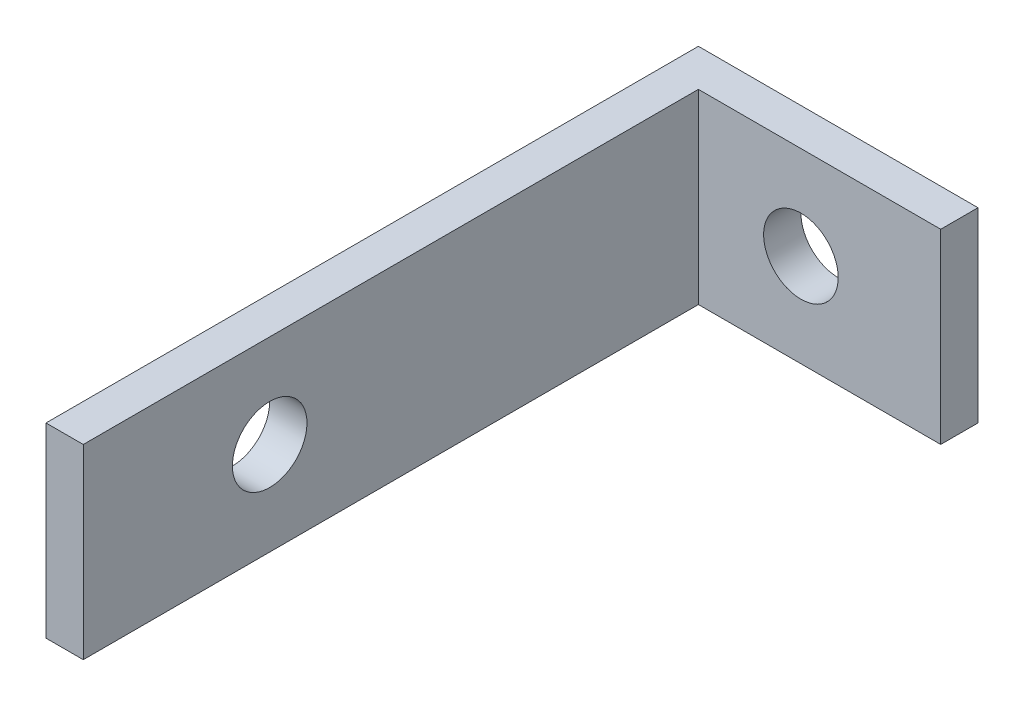
ISO-10303-21;
HEADER;
FILE_DESCRIPTION(('STEP AP214'),'2;1');
FILE_NAME('part.step','',(''),(''),'','','');
FILE_SCHEMA(('AUTOMOTIVE_DESIGN { 1 0 10303 214 1 1 1 1 }'));
ENDSEC;
DATA;
#1=APPLICATION_CONTEXT('core data for automotive mechanical design processes');
#2=APPLICATION_PROTOCOL_DEFINITION('international standard','automotive_design',2000,#1);
#3=PRODUCT_CONTEXT('',#1,'mechanical');
#4=PRODUCT('Part','Part','',(#3));
#5=PRODUCT_RELATED_PRODUCT_CATEGORY('part','',(#4));
#6=PRODUCT_DEFINITION_FORMATION('','',#4);
#7=PRODUCT_DEFINITION_CONTEXT('part definition',#1,'design');
#8=PRODUCT_DEFINITION('design','',#6,#7);
#9=PRODUCT_DEFINITION_SHAPE('','',#8);
#10=(LENGTH_UNIT() NAMED_UNIT(*) SI_UNIT(.MILLI.,.METRE.));
#11=(NAMED_UNIT(*) PLANE_ANGLE_UNIT() SI_UNIT($,.RADIAN.));
#12=(NAMED_UNIT(*) SI_UNIT($,.STERADIAN.) SOLID_ANGLE_UNIT());
#13=UNCERTAINTY_MEASURE_WITH_UNIT(LENGTH_MEASURE(1.E-05),#10,'distance_accuracy_value','');
#14=(GEOMETRIC_REPRESENTATION_CONTEXT(3) GLOBAL_UNCERTAINTY_ASSIGNED_CONTEXT((#13)) GLOBAL_UNIT_ASSIGNED_CONTEXT((#10,
#11,#12)) REPRESENTATION_CONTEXT('',''));
#15=CARTESIAN_POINT('',(0.,0.,0.));
#16=DIRECTION('',(0.,0.,1.));
#17=DIRECTION('',(1.,0.,0.));
#18=AXIS2_PLACEMENT_3D('',#15,#16,#17);
#19=CARTESIAN_POINT('',(7.5,5.,2.));
#20=DIRECTION('',(-1.,0.,0.));
#21=DIRECTION('',(0.,-1.,0.));
#22=AXIS2_PLACEMENT_3D('',#19,#20,#21);
#23=PLANE('',#22);
#24=DIRECTION('',(0.,1.,0.));
#25=VECTOR('',#24,1.);
#26=CARTESIAN_POINT('',(7.5,5.,0.));
#27=LINE('',#26,#25);
#28=CARTESIAN_POINT('',(7.5,-5.,0.));
#29=VERTEX_POINT('',#28);
#30=CARTESIAN_POINT('',(7.5,5.,0.));
#31=VERTEX_POINT('',#30);
#32=EDGE_CURVE('E90',#29,#31,#27,.T.);
#33=ORIENTED_EDGE('',*,*,#32,.T.);
#34=DIRECTION('',(0.,0.,-1.));
#35=VECTOR('',#34,1.);
#36=CARTESIAN_POINT('',(7.5,5.,2.));
#37=LINE('',#36,#35);
#38=CARTESIAN_POINT('',(7.5,5.,2.));
#39=VERTEX_POINT('',#38);
#40=EDGE_CURVE('E11',#39,#31,#37,.T.);
#41=ORIENTED_EDGE('',*,*,#40,.F.);
#42=DIRECTION('',(0.,1.,0.));
#43=VECTOR('',#42,1.);
#44=CARTESIAN_POINT('',(7.5,5.,2.));
#45=LINE('',#44,#43);
#46=CARTESIAN_POINT('',(7.5,-5.,2.));
#47=VERTEX_POINT('',#46);
#48=EDGE_CURVE('E84',#47,#39,#45,.T.);
#49=ORIENTED_EDGE('',*,*,#48,.F.);
#50=DIRECTION('',(0.,0.,-1.));
#51=VECTOR('',#50,1.);
#52=CARTESIAN_POINT('',(7.5,-5.,2.));
#53=LINE('',#52,#51);
#54=EDGE_CURVE('E76',#47,#29,#53,.T.);
#55=ORIENTED_EDGE('',*,*,#54,.T.);
#56=EDGE_LOOP('',(#33,#41,#49,#55));
#57=FACE_BOUND('',#56,.T.);
#58=ADVANCED_FACE('F34',(#57),#23,.F.);
#59=CARTESIAN_POINT('',(-7.5,5.,2.));
#60=DIRECTION('',(0.,-1.,0.));
#61=DIRECTION('',(0.,0.,-1.));
#62=AXIS2_PLACEMENT_3D('',#59,#60,#61);
#63=PLANE('',#62);
#64=DIRECTION('',(-1.,0.,0.));
#65=VECTOR('',#64,1.);
#66=CARTESIAN_POINT('',(-7.5,5.,0.));
#67=LINE('',#66,#65);
#68=CARTESIAN_POINT('',(-7.5,5.,0.));
#69=VERTEX_POINT('',#68);
#70=EDGE_CURVE('E93',#31,#69,#67,.T.);
#71=ORIENTED_EDGE('',*,*,#70,.T.);
#72=DIRECTION('',(0.,0.,-1.));
#73=VECTOR('',#72,1.);
#74=CARTESIAN_POINT('',(-7.5,5.,2.));
#75=LINE('',#74,#73);
#76=CARTESIAN_POINT('',(-7.5,5.,35.));
#77=VERTEX_POINT('',#76);
#78=EDGE_CURVE('E41',#77,#69,#75,.T.);
#79=ORIENTED_EDGE('',*,*,#78,.F.);
#80=DIRECTION('',(-1.,0.,0.));
#81=VECTOR('',#80,1.);
#82=CARTESIAN_POINT('',(-7.5,5.,35.));
#83=LINE('',#82,#81);
#84=CARTESIAN_POINT('',(-5.5,5.,35.));
#85=VERTEX_POINT('',#84);
#86=EDGE_CURVE('E117',#85,#77,#83,.T.);
#87=ORIENTED_EDGE('',*,*,#86,.F.);
#88=DIRECTION('',(0.,0.,-1.));
#89=VECTOR('',#88,1.);
#90=CARTESIAN_POINT('',(-5.5,5.,35.));
#91=LINE('',#90,#89);
#92=CARTESIAN_POINT('',(-5.5,5.,2.));
#93=VERTEX_POINT('',#92);
#94=EDGE_CURVE('E127',#85,#93,#91,.T.);
#95=ORIENTED_EDGE('',*,*,#94,.T.);
#96=DIRECTION('',(-1.,0.,0.));
#97=VECTOR('',#96,1.);
#98=CARTESIAN_POINT('',(-7.5,5.,2.));
#99=LINE('',#98,#97);
#100=EDGE_CURVE('E141',#39,#93,#99,.T.);
#101=ORIENTED_EDGE('',*,*,#100,.F.);
#102=ORIENTED_EDGE('',*,*,#40,.T.);
#103=EDGE_LOOP('',(#71,#79,#87,#95,#101,#102));
#104=FACE_BOUND('',#103,.T.);
#105=ADVANCED_FACE('F114',(#104),#63,.F.);
#106=CARTESIAN_POINT('',(-7.5,5.,2.));
#107=DIRECTION('',(1.,0.,0.));
#108=DIRECTION('',(0.,1.,0.));
#109=AXIS2_PLACEMENT_3D('',#106,#107,#108);
#110=PLANE('',#109);
#111=CARTESIAN_POINT('',(-7.5,0.,25.));
#112=DIRECTION('',(1.,0.,0.));
#113=DIRECTION('',(0.,1.,0.));
#114=AXIS2_PLACEMENT_3D('',#111,#112,#113);
#115=CIRCLE('',#114,2.);
#116=CARTESIAN_POINT('',(-7.5,2.,25.));
#117=VERTEX_POINT('',#116);
#118=EDGE_CURVE('E135',#117,#117,#115,.T.);
#119=ORIENTED_EDGE('',*,*,#118,.T.);
#120=EDGE_LOOP('',(#119));
#121=FACE_BOUND('',#120,.T.);
#122=DIRECTION('',(0.,-1.,0.));
#123=VECTOR('',#122,1.);
#124=CARTESIAN_POINT('',(-7.5,5.,0.));
#125=LINE('',#124,#123);
#126=CARTESIAN_POINT('',(-7.5,-5.,0.));
#127=VERTEX_POINT('',#126);
#128=EDGE_CURVE('E85',#69,#127,#125,.T.);
#129=ORIENTED_EDGE('',*,*,#128,.T.);
#130=DIRECTION('',(0.,0.,-1.));
#131=VECTOR('',#130,1.);
#132=CARTESIAN_POINT('',(-7.5,-5.,2.));
#133=LINE('',#132,#131);
#134=CARTESIAN_POINT('',(-7.5,-5.,35.));
#135=VERTEX_POINT('',#134);
#136=EDGE_CURVE('E80',#135,#127,#133,.T.);
#137=ORIENTED_EDGE('',*,*,#136,.F.);
#138=DIRECTION('',(0.,-1.,0.));
#139=VECTOR('',#138,1.);
#140=CARTESIAN_POINT('',(-7.5,5.,35.));
#141=LINE('',#140,#139);
#142=EDGE_CURVE('E110',#77,#135,#141,.T.);
#143=ORIENTED_EDGE('',*,*,#142,.F.);
#144=ORIENTED_EDGE('',*,*,#78,.T.);
#145=EDGE_LOOP('',(#129,#137,#143,#144));
#146=FACE_BOUND('',#145,.T.);
#147=ADVANCED_FACE('F108',(#121,#146),#110,.F.);
#148=CARTESIAN_POINT('',(-7.5,-5.,2.));
#149=DIRECTION('',(0.,1.,0.));
#150=DIRECTION('',(0.,0.,1.));
#151=AXIS2_PLACEMENT_3D('',#148,#149,#150);
#152=PLANE('',#151);
#153=DIRECTION('',(1.,0.,0.));
#154=VECTOR('',#153,1.);
#155=CARTESIAN_POINT('',(-7.5,-5.,0.));
#156=LINE('',#155,#154);
#157=EDGE_CURVE('E73',#127,#29,#156,.T.);
#158=ORIENTED_EDGE('',*,*,#157,.T.);
#159=ORIENTED_EDGE('',*,*,#54,.F.);
#160=DIRECTION('',(1.,0.,0.));
#161=VECTOR('',#160,1.);
#162=CARTESIAN_POINT('',(-7.5,-5.,2.));
#163=LINE('',#162,#161);
#164=CARTESIAN_POINT('',(-5.5,-5.,2.));
#165=VERTEX_POINT('',#164);
#166=EDGE_CURVE('E53',#165,#47,#163,.T.);
#167=ORIENTED_EDGE('',*,*,#166,.F.);
#168=DIRECTION('',(0.,0.,-1.));
#169=VECTOR('',#168,1.);
#170=CARTESIAN_POINT('',(-5.5,-5.,35.));
#171=LINE('',#170,#169);
#172=CARTESIAN_POINT('',(-5.5,-5.,35.));
#173=VERTEX_POINT('',#172);
#174=EDGE_CURVE('E129',#173,#165,#171,.T.);
#175=ORIENTED_EDGE('',*,*,#174,.F.);
#176=DIRECTION('',(1.,0.,0.));
#177=VECTOR('',#176,1.);
#178=CARTESIAN_POINT('',(-7.5,-5.,35.));
#179=LINE('',#178,#177);
#180=EDGE_CURVE('E131',#135,#173,#179,.T.);
#181=ORIENTED_EDGE('',*,*,#180,.F.);
#182=ORIENTED_EDGE('',*,*,#136,.T.);
#183=EDGE_LOOP('',(#158,#159,#167,#175,#181,#182));
#184=FACE_BOUND('',#183,.T.);
#185=ADVANCED_FACE('F75',(#184),#152,.F.);
#186=CARTESIAN_POINT('',(0.,0.,2.));
#187=DIRECTION('',(0.,0.,1.));
#188=DIRECTION('',(1.,0.,0.));
#189=AXIS2_PLACEMENT_3D('',#186,#187,#188);
#190=PLANE('',#189);
#191=DIRECTION('',(0.,1.,0.));
#192=VECTOR('',#191,1.);
#193=CARTESIAN_POINT('',(-5.5,5.,2.));
#194=LINE('',#193,#192);
#195=EDGE_CURVE('E48',#165,#93,#194,.T.);
#196=ORIENTED_EDGE('',*,*,#195,.F.);
#197=ORIENTED_EDGE('',*,*,#166,.T.);
#198=ORIENTED_EDGE('',*,*,#48,.T.);
#199=ORIENTED_EDGE('',*,*,#100,.T.);
#200=EDGE_LOOP('',(#196,#197,#198,#199));
#201=FACE_BOUND('',#200,.T.);
#202=CARTESIAN_POINT('',(0.,0.,2.));
#203=DIRECTION('',(0.,0.,1.));
#204=DIRECTION('',(1.,0.,0.));
#205=AXIS2_PLACEMENT_3D('',#202,#203,#204);
#206=CIRCLE('',#205,2.);
#207=CARTESIAN_POINT('',(2.,0.,2.));
#208=VERTEX_POINT('',#207);
#209=EDGE_CURVE('E98',#208,#208,#206,.T.);
#210=ORIENTED_EDGE('',*,*,#209,.F.);
#211=EDGE_LOOP('',(#210));
#212=FACE_BOUND('',#211,.T.);
#213=ADVANCED_FACE('F143',(#201,#212),#190,.T.);
#214=CARTESIAN_POINT('',(0.,0.,0.));
#215=DIRECTION('',(0.,0.,1.));
#216=DIRECTION('',(1.,0.,0.));
#217=AXIS2_PLACEMENT_3D('',#214,#215,#216);
#218=PLANE('',#217);
#219=CARTESIAN_POINT('',(0.,0.,0.));
#220=DIRECTION('',(0.,0.,1.));
#221=DIRECTION('',(1.,0.,0.));
#222=AXIS2_PLACEMENT_3D('',#219,#220,#221);
#223=CIRCLE('',#222,2.);
#224=CARTESIAN_POINT('',(2.,0.,0.));
#225=VERTEX_POINT('',#224);
#226=EDGE_CURVE('E94',#225,#225,#223,.T.);
#227=ORIENTED_EDGE('',*,*,#226,.T.);
#228=EDGE_LOOP('',(#227));
#229=FACE_BOUND('',#228,.T.);
#230=ORIENTED_EDGE('',*,*,#32,.F.);
#231=ORIENTED_EDGE('',*,*,#157,.F.);
#232=ORIENTED_EDGE('',*,*,#128,.F.);
#233=ORIENTED_EDGE('',*,*,#70,.F.);
#234=EDGE_LOOP('',(#230,#231,#232,#233));
#235=FACE_BOUND('',#234,.T.);
#236=ADVANCED_FACE('F92',(#229,#235),#218,.F.);
#237=CARTESIAN_POINT('',(0.,0.,0.));
#238=DIRECTION('',(0.,0.,1.));
#239=DIRECTION('',(1.,0.,0.));
#240=AXIS2_PLACEMENT_3D('',#237,#238,#239);
#241=CYLINDRICAL_SURFACE('',#240,2.);
#242=ORIENTED_EDGE('',*,*,#226,.F.);
#243=EDGE_LOOP('',(#242));
#244=FACE_BOUND('',#243,.T.);
#245=ORIENTED_EDGE('',*,*,#209,.T.);
#246=EDGE_LOOP('',(#245));
#247=FACE_BOUND('',#246,.T.);
#248=ADVANCED_FACE('F164',(#244,#247),#241,.F.);
#249=CARTESIAN_POINT('',(-5.5,5.,35.));
#250=DIRECTION('',(-1.,0.,0.));
#251=DIRECTION('',(0.,-1.,0.));
#252=AXIS2_PLACEMENT_3D('',#249,#250,#251);
#253=PLANE('',#252);
#254=CARTESIAN_POINT('',(-5.5,0.,25.));
#255=DIRECTION('',(1.,0.,0.));
#256=DIRECTION('',(0.,1.,0.));
#257=AXIS2_PLACEMENT_3D('',#254,#255,#256);
#258=CIRCLE('',#257,2.);
#259=CARTESIAN_POINT('',(-5.5,2.,25.));
#260=VERTEX_POINT('',#259);
#261=EDGE_CURVE('E156',#260,#260,#258,.T.);
#262=ORIENTED_EDGE('',*,*,#261,.F.);
#263=EDGE_LOOP('',(#262));
#264=FACE_BOUND('',#263,.T.);
#265=ORIENTED_EDGE('',*,*,#195,.T.);
#266=ORIENTED_EDGE('',*,*,#94,.F.);
#267=DIRECTION('',(0.,1.,0.));
#268=VECTOR('',#267,1.);
#269=CARTESIAN_POINT('',(-5.5,5.,35.));
#270=LINE('',#269,#268);
#271=EDGE_CURVE('E125',#173,#85,#270,.T.);
#272=ORIENTED_EDGE('',*,*,#271,.F.);
#273=ORIENTED_EDGE('',*,*,#174,.T.);
#274=EDGE_LOOP('',(#265,#266,#272,#273));
#275=FACE_BOUND('',#274,.T.);
#276=ADVANCED_FACE('F146',(#264,#275),#253,.F.);
#277=CARTESIAN_POINT('',(0.,0.,35.));
#278=DIRECTION('',(0.,0.,1.));
#279=DIRECTION('',(1.,0.,0.));
#280=AXIS2_PLACEMENT_3D('',#277,#278,#279);
#281=PLANE('',#280);
#282=ORIENTED_EDGE('',*,*,#142,.T.);
#283=ORIENTED_EDGE('',*,*,#180,.T.);
#284=ORIENTED_EDGE('',*,*,#271,.T.);
#285=ORIENTED_EDGE('',*,*,#86,.T.);
#286=EDGE_LOOP('',(#282,#283,#284,#285));
#287=FACE_BOUND('',#286,.T.);
#288=ADVANCED_FACE('F121',(#287),#281,.T.);
#289=CARTESIAN_POINT('',(-38.5,0.,25.));
#290=DIRECTION('',(1.,0.,0.));
#291=DIRECTION('',(0.,1.,0.));
#292=AXIS2_PLACEMENT_3D('',#289,#290,#291);
#293=CYLINDRICAL_SURFACE('',#292,2.);
#294=ORIENTED_EDGE('',*,*,#261,.T.);
#295=EDGE_LOOP('',(#294));
#296=FACE_BOUND('',#295,.T.);
#297=ORIENTED_EDGE('',*,*,#118,.F.);
#298=EDGE_LOOP('',(#297));
#299=FACE_BOUND('',#298,.T.);
#300=ADVANCED_FACE('F160',(#296,#299),#293,.F.);
#301=CLOSED_SHELL('',(#58,#105,#147,#185,#213,#236,#248,#276,#288,#300));
#302=MANIFOLD_SOLID_BREP('B2',#301);
#303=ADVANCED_BREP_SHAPE_REPRESENTATION('',(#18,#302),#14);
#304=SHAPE_DEFINITION_REPRESENTATION(#9,#303);
ENDSEC;
END-ISO-10303-21;
